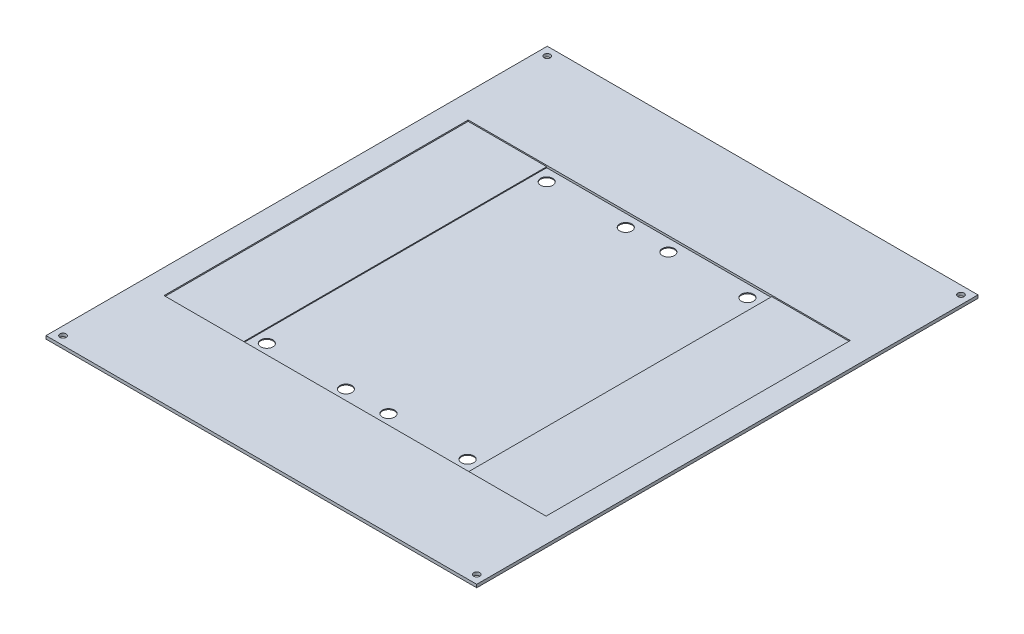
ISO-10303-21;
HEADER;
FILE_DESCRIPTION(('STEP AP214'),'2;1');
FILE_NAME('part.step','',(''),(''),'','','');
FILE_SCHEMA(('AUTOMOTIVE_DESIGN { 1 0 10303 214 1 1 1 1 }'));
ENDSEC;
DATA;
#1=APPLICATION_CONTEXT('core data for automotive mechanical design processes');
#2=APPLICATION_PROTOCOL_DEFINITION('international standard','automotive_design',2000,#1);
#3=PRODUCT_CONTEXT('',#1,'mechanical');
#4=PRODUCT('Part','Part','',(#3));
#5=PRODUCT_RELATED_PRODUCT_CATEGORY('part','',(#4));
#6=PRODUCT_DEFINITION_FORMATION('','',#4);
#7=PRODUCT_DEFINITION_CONTEXT('part definition',#1,'design');
#8=PRODUCT_DEFINITION('design','',#6,#7);
#9=PRODUCT_DEFINITION_SHAPE('','',#8);
#10=(LENGTH_UNIT() NAMED_UNIT(*) SI_UNIT(.MILLI.,.METRE.));
#11=(NAMED_UNIT(*) PLANE_ANGLE_UNIT() SI_UNIT($,.RADIAN.));
#12=(NAMED_UNIT(*) SI_UNIT($,.STERADIAN.) SOLID_ANGLE_UNIT());
#13=UNCERTAINTY_MEASURE_WITH_UNIT(LENGTH_MEASURE(1.E-05),#10,'distance_accuracy_value','');
#14=(GEOMETRIC_REPRESENTATION_CONTEXT(3) GLOBAL_UNCERTAINTY_ASSIGNED_CONTEXT((#13)) GLOBAL_UNIT_ASSIGNED_CONTEXT((#10,
#11,#12)) REPRESENTATION_CONTEXT('',''));
#15=CARTESIAN_POINT('',(0.,0.,0.));
#16=DIRECTION('',(0.,0.,1.));
#17=DIRECTION('',(1.,0.,0.));
#18=AXIS2_PLACEMENT_3D('',#15,#16,#17);
#19=CARTESIAN_POINT('',(169.,1.5,-654.));
#20=DIRECTION('',(-1.,0.,0.));
#21=DIRECTION('',(0.,0.,1.));
#22=AXIS2_PLACEMENT_3D('',#19,#20,#21);
#23=PLANE('',#22);
#24=DIRECTION('',(0.,0.,-1.));
#25=VECTOR('',#24,1.);
#26=CARTESIAN_POINT('',(169.,3.,-654.));
#27=LINE('',#26,#25);
#28=CARTESIAN_POINT('',(169.,3.,-154.));
#29=VERTEX_POINT('',#28);
#30=CARTESIAN_POINT('',(169.,3.,-654.));
#31=VERTEX_POINT('',#30);
#32=EDGE_CURVE('E254',#29,#31,#27,.T.);
#33=ORIENTED_EDGE('',*,*,#32,.F.);
#34=DIRECTION('',(0.,1.,0.));
#35=VECTOR('',#34,1.);
#36=CARTESIAN_POINT('',(169.,1.5,-154.));
#37=LINE('',#36,#35);
#38=CARTESIAN_POINT('',(169.,1.5,-154.));
#39=VERTEX_POINT('',#38);
#40=EDGE_CURVE('E150',#39,#29,#37,.T.);
#41=ORIENTED_EDGE('',*,*,#40,.F.);
#42=DIRECTION('',(0.,0.,1.));
#43=VECTOR('',#42,1.);
#44=CARTESIAN_POINT('',(169.,1.5,-654.));
#45=LINE('',#44,#43);
#46=CARTESIAN_POINT('',(169.,1.5,-654.));
#47=VERTEX_POINT('',#46);
#48=EDGE_CURVE('E248',#47,#39,#45,.T.);
#49=ORIENTED_EDGE('',*,*,#48,.F.);
#50=DIRECTION('',(0.,1.,0.));
#51=VECTOR('',#50,1.);
#52=CARTESIAN_POINT('',(169.,1.5,-654.));
#53=LINE('',#52,#51);
#54=EDGE_CURVE('E452',#47,#31,#53,.T.);
#55=ORIENTED_EDGE('',*,*,#54,.T.);
#56=EDGE_LOOP('',(#33,#41,#49,#55));
#57=FACE_BOUND('',#56,.T.);
#58=ADVANCED_FACE('F44',(#57),#23,.F.);
#59=CARTESIAN_POINT('',(539.,1.5,-654.));
#60=DIRECTION('',(1.,0.,0.));
#61=DIRECTION('',(0.,0.,-1.));
#62=AXIS2_PLACEMENT_3D('',#59,#60,#61);
#63=PLANE('',#62);
#64=DIRECTION('',(0.,0.,1.));
#65=VECTOR('',#64,1.);
#66=CARTESIAN_POINT('',(539.,3.,-654.));
#67=LINE('',#66,#65);
#68=CARTESIAN_POINT('',(539.,3.,-654.));
#69=VERTEX_POINT('',#68);
#70=CARTESIAN_POINT('',(539.,3.,-154.));
#71=VERTEX_POINT('',#70);
#72=EDGE_CURVE('E306',#69,#71,#67,.T.);
#73=ORIENTED_EDGE('',*,*,#72,.F.);
#74=DIRECTION('',(0.,1.,0.));
#75=VECTOR('',#74,1.);
#76=CARTESIAN_POINT('',(539.,1.5,-654.));
#77=LINE('',#76,#75);
#78=CARTESIAN_POINT('',(539.,1.5,-654.));
#79=VERTEX_POINT('',#78);
#80=EDGE_CURVE('E454',#79,#69,#77,.T.);
#81=ORIENTED_EDGE('',*,*,#80,.F.);
#82=DIRECTION('',(0.,0.,-1.));
#83=VECTOR('',#82,1.);
#84=CARTESIAN_POINT('',(539.,1.5,-654.));
#85=LINE('',#84,#83);
#86=CARTESIAN_POINT('',(539.,1.5,-154.));
#87=VERTEX_POINT('',#86);
#88=EDGE_CURVE('E261',#87,#79,#85,.T.);
#89=ORIENTED_EDGE('',*,*,#88,.F.);
#90=DIRECTION('',(0.,1.,0.));
#91=VECTOR('',#90,1.);
#92=CARTESIAN_POINT('',(539.,1.5,-154.));
#93=LINE('',#92,#91);
#94=EDGE_CURVE('E456',#87,#71,#93,.T.);
#95=ORIENTED_EDGE('',*,*,#94,.T.);
#96=EDGE_LOOP('',(#73,#81,#89,#95));
#97=FACE_BOUND('',#96,.T.);
#98=ADVANCED_FACE('F384',(#97),#63,.F.);
#99=CARTESIAN_POINT('',(0.,5.,0.));
#100=DIRECTION('',(1.,0.,0.));
#101=DIRECTION('',(0.,0.,-1.));
#102=AXIS2_PLACEMENT_3D('',#99,#100,#101);
#103=PLANE('',#102);
#104=DIRECTION('',(0.,0.,1.));
#105=VECTOR('',#104,1.);
#106=CARTESIAN_POINT('',(0.,0.,0.));
#107=LINE('',#106,#105);
#108=CARTESIAN_POINT('',(0.,0.,-824.));
#109=VERTEX_POINT('',#108);
#110=CARTESIAN_POINT('',(0.,0.,0.));
#111=VERTEX_POINT('',#110);
#112=EDGE_CURVE('E421',#109,#111,#107,.T.);
#113=ORIENTED_EDGE('',*,*,#112,.T.);
#114=DIRECTION('',(0.,-1.,0.));
#115=VECTOR('',#114,1.);
#116=CARTESIAN_POINT('',(0.,5.,0.));
#117=LINE('',#116,#115);
#118=CARTESIAN_POINT('',(0.,5.,0.));
#119=VERTEX_POINT('',#118);
#120=EDGE_CURVE('E12',#119,#111,#117,.T.);
#121=ORIENTED_EDGE('',*,*,#120,.F.);
#122=DIRECTION('',(0.,0.,1.));
#123=VECTOR('',#122,1.);
#124=CARTESIAN_POINT('',(0.,5.,0.));
#125=LINE('',#124,#123);
#126=CARTESIAN_POINT('',(0.,5.,-824.));
#127=VERTEX_POINT('',#126);
#128=EDGE_CURVE('E286',#127,#119,#125,.T.);
#129=ORIENTED_EDGE('',*,*,#128,.F.);
#130=DIRECTION('',(0.,-1.,0.));
#131=VECTOR('',#130,1.);
#132=CARTESIAN_POINT('',(0.,5.,-824.));
#133=LINE('',#132,#131);
#134=EDGE_CURVE('E430',#127,#109,#133,.T.);
#135=ORIENTED_EDGE('',*,*,#134,.T.);
#136=EDGE_LOOP('',(#113,#121,#129,#135));
#137=FACE_BOUND('',#136,.T.);
#138=ADVANCED_FACE('F46',(#137),#103,.F.);
#139=CARTESIAN_POINT('',(0.,5.,0.));
#140=DIRECTION('',(0.,0.,-1.));
#141=DIRECTION('',(-1.,0.,0.));
#142=AXIS2_PLACEMENT_3D('',#139,#140,#141);
#143=PLANE('',#142);
#144=DIRECTION('',(1.,0.,0.));
#145=VECTOR('',#144,1.);
#146=CARTESIAN_POINT('',(0.,0.,0.));
#147=LINE('',#146,#145);
#148=CARTESIAN_POINT('',(708.,0.,0.));
#149=VERTEX_POINT('',#148);
#150=EDGE_CURVE('E412',#111,#149,#147,.T.);
#151=ORIENTED_EDGE('',*,*,#150,.T.);
#152=DIRECTION('',(0.,-1.,0.));
#153=VECTOR('',#152,1.);
#154=CARTESIAN_POINT('',(708.,5.,0.));
#155=LINE('',#154,#153);
#156=CARTESIAN_POINT('',(708.,5.,0.));
#157=VERTEX_POINT('',#156);
#158=EDGE_CURVE('E53',#157,#149,#155,.T.);
#159=ORIENTED_EDGE('',*,*,#158,.F.);
#160=DIRECTION('',(1.,0.,0.));
#161=VECTOR('',#160,1.);
#162=CARTESIAN_POINT('',(0.,5.,0.));
#163=LINE('',#162,#161);
#164=EDGE_CURVE('E291',#119,#157,#163,.T.);
#165=ORIENTED_EDGE('',*,*,#164,.F.);
#166=ORIENTED_EDGE('',*,*,#120,.T.);
#167=EDGE_LOOP('',(#151,#159,#165,#166));
#168=FACE_BOUND('',#167,.T.);
#169=ADVANCED_FACE('F403',(#168),#143,.F.);
#170=CARTESIAN_POINT('',(708.,5.,0.));
#171=DIRECTION('',(-1.,0.,0.));
#172=DIRECTION('',(0.,0.,1.));
#173=AXIS2_PLACEMENT_3D('',#170,#171,#172);
#174=PLANE('',#173);
#175=DIRECTION('',(0.,0.,-1.));
#176=VECTOR('',#175,1.);
#177=CARTESIAN_POINT('',(708.,0.,0.));
#178=LINE('',#177,#176);
#179=CARTESIAN_POINT('',(708.,0.,-824.));
#180=VERTEX_POINT('',#179);
#181=EDGE_CURVE('E420',#149,#180,#178,.T.);
#182=ORIENTED_EDGE('',*,*,#181,.T.);
#183=DIRECTION('',(0.,-1.,0.));
#184=VECTOR('',#183,1.);
#185=CARTESIAN_POINT('',(708.,5.,-824.));
#186=LINE('',#185,#184);
#187=CARTESIAN_POINT('',(708.,5.,-824.));
#188=VERTEX_POINT('',#187);
#189=EDGE_CURVE('E425',#188,#180,#186,.T.);
#190=ORIENTED_EDGE('',*,*,#189,.F.);
#191=DIRECTION('',(0.,0.,-1.));
#192=VECTOR('',#191,1.);
#193=CARTESIAN_POINT('',(708.,5.,0.));
#194=LINE('',#193,#192);
#195=EDGE_CURVE('E297',#157,#188,#194,.T.);
#196=ORIENTED_EDGE('',*,*,#195,.F.);
#197=ORIENTED_EDGE('',*,*,#158,.T.);
#198=EDGE_LOOP('',(#182,#190,#196,#197));
#199=FACE_BOUND('',#198,.T.);
#200=ADVANCED_FACE('F400',(#199),#174,.F.);
#201=CARTESIAN_POINT('',(0.,5.,-824.));
#202=DIRECTION('',(0.,0.,1.));
#203=DIRECTION('',(1.,0.,0.));
#204=AXIS2_PLACEMENT_3D('',#201,#202,#203);
#205=PLANE('',#204);
#206=DIRECTION('',(-1.,0.,0.));
#207=VECTOR('',#206,1.);
#208=CARTESIAN_POINT('',(0.,0.,-824.));
#209=LINE('',#208,#207);
#210=EDGE_CURVE('E292',#180,#109,#209,.T.);
#211=ORIENTED_EDGE('',*,*,#210,.T.);
#212=ORIENTED_EDGE('',*,*,#134,.F.);
#213=DIRECTION('',(-1.,0.,0.));
#214=VECTOR('',#213,1.);
#215=CARTESIAN_POINT('',(0.,5.,-824.));
#216=LINE('',#215,#214);
#217=EDGE_CURVE('E301',#188,#127,#216,.T.);
#218=ORIENTED_EDGE('',*,*,#217,.F.);
#219=ORIENTED_EDGE('',*,*,#189,.T.);
#220=EDGE_LOOP('',(#211,#212,#218,#219));
#221=FACE_BOUND('',#220,.T.);
#222=ADVANCED_FACE('F363',(#221),#205,.F.);
#223=CARTESIAN_POINT('',(0.,5.,0.));
#224=DIRECTION('',(0.,-1.,0.));
#225=DIRECTION('',(0.,0.,-1.));
#226=AXIS2_PLACEMENT_3D('',#223,#224,#225);
#227=PLANE('',#226);
#228=CARTESIAN_POINT('',(694.,5.,-810.));
#229=DIRECTION('',(0.,1.,0.));
#230=DIRECTION('',(0.,0.,-1.));
#231=AXIS2_PLACEMENT_3D('',#228,#229,#230);
#232=CIRCLE('',#231,5.1);
#233=CARTESIAN_POINT('',(694.,5.,-815.1));
#234=VERTEX_POINT('',#233);
#235=EDGE_CURVE('E234',#234,#234,#232,.T.);
#236=ORIENTED_EDGE('',*,*,#235,.F.);
#237=EDGE_LOOP('',(#236));
#238=FACE_BOUND('',#237,.T.);
#239=CARTESIAN_POINT('',(694.,5.,-14.));
#240=DIRECTION('',(0.,-1.,0.));
#241=DIRECTION('',(0.,0.,1.));
#242=AXIS2_PLACEMENT_3D('',#239,#240,#241);
#243=CIRCLE('',#242,5.1);
#244=CARTESIAN_POINT('',(694.,5.,-8.90000000000001));
#245=VERTEX_POINT('',#244);
#246=EDGE_CURVE('E337',#245,#245,#243,.T.);
#247=ORIENTED_EDGE('',*,*,#246,.T.);
#248=EDGE_LOOP('',(#247));
#249=FACE_BOUND('',#248,.T.);
#250=CARTESIAN_POINT('',(14.,5.,-810.));
#251=DIRECTION('',(0.,-1.,0.));
#252=DIRECTION('',(0.,0.,-1.));
#253=AXIS2_PLACEMENT_3D('',#250,#251,#252);
#254=CIRCLE('',#253,5.1);
#255=CARTESIAN_POINT('',(14.,5.,-815.1));
#256=VERTEX_POINT('',#255);
#257=EDGE_CURVE('E334',#256,#256,#254,.T.);
#258=ORIENTED_EDGE('',*,*,#257,.T.);
#259=EDGE_LOOP('',(#258));
#260=FACE_BOUND('',#259,.T.);
#261=CARTESIAN_POINT('',(14.,5.,-14.));
#262=DIRECTION('',(0.,1.,0.));
#263=DIRECTION('',(0.,0.,1.));
#264=AXIS2_PLACEMENT_3D('',#261,#262,#263);
#265=CIRCLE('',#264,5.1);
#266=CARTESIAN_POINT('',(14.,5.,-8.90000000000001));
#267=VERTEX_POINT('',#266);
#268=EDGE_CURVE('E168',#267,#267,#265,.T.);
#269=ORIENTED_EDGE('',*,*,#268,.F.);
#270=EDGE_LOOP('',(#269));
#271=FACE_BOUND('',#270,.T.);
#272=DIRECTION('',(-1.,0.,0.));
#273=VECTOR('',#272,1.);
#274=CARTESIAN_POINT('',(169.,5.,-654.));
#275=LINE('',#274,#273);
#276=CARTESIAN_POINT('',(668.,5.,-654.));
#277=VERTEX_POINT('',#276);
#278=CARTESIAN_POINT('',(40.,5.,-654.));
#279=VERTEX_POINT('',#278);
#280=EDGE_CURVE('E253',#277,#279,#275,.T.);
#281=ORIENTED_EDGE('',*,*,#280,.F.);
#282=DIRECTION('',(0.,0.,-1.));
#283=VECTOR('',#282,1.);
#284=CARTESIAN_POINT('',(668.,5.,-654.));
#285=LINE('',#284,#283);
#286=CARTESIAN_POINT('',(668.,5.,-154.));
#287=VERTEX_POINT('',#286);
#288=EDGE_CURVE('E159',#287,#277,#285,.T.);
#289=ORIENTED_EDGE('',*,*,#288,.F.);
#290=DIRECTION('',(1.,0.,0.));
#291=VECTOR('',#290,1.);
#292=CARTESIAN_POINT('',(169.,5.,-154.));
#293=LINE('',#292,#291);
#294=CARTESIAN_POINT('',(40.0000000000001,5.,-154.));
#295=VERTEX_POINT('',#294);
#296=EDGE_CURVE('E271',#295,#287,#293,.T.);
#297=ORIENTED_EDGE('',*,*,#296,.F.);
#298=DIRECTION('',(0.,0.,1.));
#299=VECTOR('',#298,1.);
#300=CARTESIAN_POINT('',(40.,5.,-654.));
#301=LINE('',#300,#299);
#302=EDGE_CURVE('E143',#279,#295,#301,.T.);
#303=ORIENTED_EDGE('',*,*,#302,.F.);
#304=EDGE_LOOP('',(#281,#289,#297,#303));
#305=FACE_BOUND('',#304,.T.);
#306=ORIENTED_EDGE('',*,*,#128,.T.);
#307=ORIENTED_EDGE('',*,*,#164,.T.);
#308=ORIENTED_EDGE('',*,*,#195,.T.);
#309=ORIENTED_EDGE('',*,*,#217,.T.);
#310=EDGE_LOOP('',(#306,#307,#308,#309));
#311=FACE_BOUND('',#310,.T.);
#312=ADVANCED_FACE('F319',(#238,#249,#260,#271,#305,#311),#227,.F.);
#313=CARTESIAN_POINT('',(0.,0.,0.));
#314=DIRECTION('',(0.,-1.,0.));
#315=DIRECTION('',(0.,0.,-1.));
#316=AXIS2_PLACEMENT_3D('',#313,#314,#315);
#317=PLANE('',#316);
#318=CARTESIAN_POINT('',(319.,0.,-634.));
#319=DIRECTION('',(0.,1.,0.));
#320=DIRECTION('',(0.,0.,1.));
#321=AXIS2_PLACEMENT_3D('',#318,#319,#320);
#322=CIRCLE('',#321,9.99999999999998);
#323=CARTESIAN_POINT('',(319.,0.,-624.));
#324=VERTEX_POINT('',#323);
#325=EDGE_CURVE('E199',#324,#324,#322,.T.);
#326=ORIENTED_EDGE('',*,*,#325,.T.);
#327=EDGE_LOOP('',(#326));
#328=FACE_BOUND('',#327,.T.);
#329=CARTESIAN_POINT('',(389.,0.,-634.));
#330=DIRECTION('',(0.,1.,0.));
#331=DIRECTION('',(0.,0.,1.));
#332=AXIS2_PLACEMENT_3D('',#329,#330,#331);
#333=CIRCLE('',#332,10.);
#334=CARTESIAN_POINT('',(389.,0.,-624.));
#335=VERTEX_POINT('',#334);
#336=EDGE_CURVE('E208',#335,#335,#333,.T.);
#337=ORIENTED_EDGE('',*,*,#336,.T.);
#338=EDGE_LOOP('',(#337));
#339=FACE_BOUND('',#338,.T.);
#340=CARTESIAN_POINT('',(519.,0.,-634.));
#341=DIRECTION('',(0.,1.,0.));
#342=DIRECTION('',(0.,0.,1.));
#343=AXIS2_PLACEMENT_3D('',#340,#341,#342);
#344=CIRCLE('',#343,9.99999999999998);
#345=CARTESIAN_POINT('',(519.,0.,-624.));
#346=VERTEX_POINT('',#345);
#347=EDGE_CURVE('E216',#346,#346,#344,.T.);
#348=ORIENTED_EDGE('',*,*,#347,.T.);
#349=EDGE_LOOP('',(#348));
#350=FACE_BOUND('',#349,.T.);
#351=CARTESIAN_POINT('',(519.,0.,-174.));
#352=DIRECTION('',(0.,1.,0.));
#353=DIRECTION('',(0.,0.,-1.));
#354=AXIS2_PLACEMENT_3D('',#351,#352,#353);
#355=CIRCLE('',#354,9.99999999999998);
#356=CARTESIAN_POINT('',(519.,0.,-184.));
#357=VERTEX_POINT('',#356);
#358=EDGE_CURVE('E227',#357,#357,#355,.T.);
#359=ORIENTED_EDGE('',*,*,#358,.T.);
#360=EDGE_LOOP('',(#359));
#361=FACE_BOUND('',#360,.T.);
#362=CARTESIAN_POINT('',(389.,0.,-174.));
#363=DIRECTION('',(0.,1.,0.));
#364=DIRECTION('',(0.,0.,-1.));
#365=AXIS2_PLACEMENT_3D('',#362,#363,#364);
#366=CIRCLE('',#365,10.);
#367=CARTESIAN_POINT('',(389.,0.,-184.));
#368=VERTEX_POINT('',#367);
#369=EDGE_CURVE('E441',#368,#368,#366,.T.);
#370=ORIENTED_EDGE('',*,*,#369,.T.);
#371=EDGE_LOOP('',(#370));
#372=FACE_BOUND('',#371,.T.);
#373=CARTESIAN_POINT('',(319.,0.,-174.));
#374=DIRECTION('',(0.,1.,0.));
#375=DIRECTION('',(0.,0.,-1.));
#376=AXIS2_PLACEMENT_3D('',#373,#374,#375);
#377=CIRCLE('',#376,9.99999999999998);
#378=CARTESIAN_POINT('',(319.,0.,-184.));
#379=VERTEX_POINT('',#378);
#380=EDGE_CURVE('E445',#379,#379,#377,.T.);
#381=ORIENTED_EDGE('',*,*,#380,.T.);
#382=EDGE_LOOP('',(#381));
#383=FACE_BOUND('',#382,.T.);
#384=CARTESIAN_POINT('',(189.,0.,-174.));
#385=DIRECTION('',(0.,1.,0.));
#386=DIRECTION('',(0.,0.,-1.));
#387=AXIS2_PLACEMENT_3D('',#384,#385,#386);
#388=CIRCLE('',#387,10.);
#389=CARTESIAN_POINT('',(189.,0.,-184.));
#390=VERTEX_POINT('',#389);
#391=EDGE_CURVE('E200',#390,#390,#388,.T.);
#392=ORIENTED_EDGE('',*,*,#391,.T.);
#393=EDGE_LOOP('',(#392));
#394=FACE_BOUND('',#393,.T.);
#395=CARTESIAN_POINT('',(189.,0.,-634.));
#396=DIRECTION('',(0.,1.,0.));
#397=DIRECTION('',(0.,0.,1.));
#398=AXIS2_PLACEMENT_3D('',#395,#396,#397);
#399=CIRCLE('',#398,10.);
#400=CARTESIAN_POINT('',(189.,0.,-624.));
#401=VERTEX_POINT('',#400);
#402=EDGE_CURVE('E231',#401,#401,#399,.T.);
#403=ORIENTED_EDGE('',*,*,#402,.T.);
#404=EDGE_LOOP('',(#403));
#405=FACE_BOUND('',#404,.T.);
#406=CARTESIAN_POINT('',(694.,0.,-810.));
#407=DIRECTION('',(0.,-1.,0.));
#408=DIRECTION('',(0.,0.,-1.));
#409=AXIS2_PLACEMENT_3D('',#406,#407,#408);
#410=CIRCLE('',#409,5.1);
#411=CARTESIAN_POINT('',(694.,0.,-815.1));
#412=VERTEX_POINT('',#411);
#413=EDGE_CURVE('E48',#412,#412,#410,.T.);
#414=ORIENTED_EDGE('',*,*,#413,.F.);
#415=EDGE_LOOP('',(#414));
#416=FACE_BOUND('',#415,.T.);
#417=CARTESIAN_POINT('',(694.,0.,-14.));
#418=DIRECTION('',(0.,-1.,0.));
#419=DIRECTION('',(0.,0.,-1.));
#420=AXIS2_PLACEMENT_3D('',#417,#418,#419);
#421=CIRCLE('',#420,5.1);
#422=CARTESIAN_POINT('',(694.,0.,-19.1));
#423=VERTEX_POINT('',#422);
#424=EDGE_CURVE('E335',#423,#423,#421,.F.);
#425=ORIENTED_EDGE('',*,*,#424,.T.);
#426=EDGE_LOOP('',(#425));
#427=FACE_BOUND('',#426,.T.);
#428=CARTESIAN_POINT('',(14.,0.,-810.));
#429=DIRECTION('',(0.,-1.,0.));
#430=DIRECTION('',(0.,0.,-1.));
#431=AXIS2_PLACEMENT_3D('',#428,#429,#430);
#432=CIRCLE('',#431,5.1);
#433=CARTESIAN_POINT('',(14.,0.,-815.1));
#434=VERTEX_POINT('',#433);
#435=EDGE_CURVE('E330',#434,#434,#432,.F.);
#436=ORIENTED_EDGE('',*,*,#435,.T.);
#437=EDGE_LOOP('',(#436));
#438=FACE_BOUND('',#437,.T.);
#439=CARTESIAN_POINT('',(14.,0.,-14.));
#440=DIRECTION('',(0.,-1.,0.));
#441=DIRECTION('',(0.,0.,-1.));
#442=AXIS2_PLACEMENT_3D('',#439,#440,#441);
#443=CIRCLE('',#442,5.1);
#444=CARTESIAN_POINT('',(14.,0.,-19.1));
#445=VERTEX_POINT('',#444);
#446=EDGE_CURVE('E323',#445,#445,#443,.T.);
#447=ORIENTED_EDGE('',*,*,#446,.F.);
#448=EDGE_LOOP('',(#447));
#449=FACE_BOUND('',#448,.T.);
#450=ORIENTED_EDGE('',*,*,#112,.F.);
#451=ORIENTED_EDGE('',*,*,#210,.F.);
#452=ORIENTED_EDGE('',*,*,#181,.F.);
#453=ORIENTED_EDGE('',*,*,#150,.F.);
#454=EDGE_LOOP('',(#450,#451,#452,#453));
#455=FACE_BOUND('',#454,.T.);
#456=ADVANCED_FACE('F362',(#328,#339,#350,#361,#372,#383,#394,#405,#416,#427,#438,#449,#455),
#317,.T.);
#457=CARTESIAN_POINT('',(169.,1.5,-654.));
#458=DIRECTION('',(0.,0.,-1.));
#459=DIRECTION('',(-1.,0.,0.));
#460=AXIS2_PLACEMENT_3D('',#457,#458,#459);
#461=PLANE('',#460);
#462=ORIENTED_EDGE('',*,*,#280,.T.);
#463=DIRECTION('',(0.,1.,0.));
#464=VECTOR('',#463,1.);
#465=CARTESIAN_POINT('',(40.,3.,-654.));
#466=LINE('',#465,#464);
#467=CARTESIAN_POINT('',(40.,3.,-654.));
#468=VERTEX_POINT('',#467);
#469=EDGE_CURVE('E309',#468,#279,#466,.T.);
#470=ORIENTED_EDGE('',*,*,#469,.F.);
#471=DIRECTION('',(-1.,0.,0.));
#472=VECTOR('',#471,1.);
#473=CARTESIAN_POINT('',(40.,3.,-654.));
#474=LINE('',#473,#472);
#475=EDGE_CURVE('E156',#31,#468,#474,.T.);
#476=ORIENTED_EDGE('',*,*,#475,.F.);
#477=ORIENTED_EDGE('',*,*,#54,.F.);
#478=DIRECTION('',(-1.,0.,0.));
#479=VECTOR('',#478,1.);
#480=CARTESIAN_POINT('',(169.,1.5,-654.));
#481=LINE('',#480,#479);
#482=EDGE_CURVE('E266',#79,#47,#481,.T.);
#483=ORIENTED_EDGE('',*,*,#482,.F.);
#484=ORIENTED_EDGE('',*,*,#80,.T.);
#485=CARTESIAN_POINT('',(668.,3.,-654.));
#486=VERTEX_POINT('',#485);
#487=EDGE_CURVE('E61',#486,#69,#474,.T.);
#488=ORIENTED_EDGE('',*,*,#487,.F.);
#489=DIRECTION('',(0.,1.,0.));
#490=VECTOR('',#489,1.);
#491=CARTESIAN_POINT('',(668.,3.,-654.));
#492=LINE('',#491,#490);
#493=EDGE_CURVE('E313',#486,#277,#492,.T.);
#494=ORIENTED_EDGE('',*,*,#493,.T.);
#495=EDGE_LOOP('',(#462,#470,#476,#477,#483,#484,#488,#494));
#496=FACE_BOUND('',#495,.T.);
#497=ADVANCED_FACE('F396',(#496),#461,.F.);
#498=CARTESIAN_POINT('',(169.,1.5,-154.));
#499=DIRECTION('',(0.,0.,1.));
#500=DIRECTION('',(1.,0.,0.));
#501=AXIS2_PLACEMENT_3D('',#498,#499,#500);
#502=PLANE('',#501);
#503=ORIENTED_EDGE('',*,*,#296,.T.);
#504=DIRECTION('',(0.,1.,0.));
#505=VECTOR('',#504,1.);
#506=CARTESIAN_POINT('',(668.,3.,-154.));
#507=LINE('',#506,#505);
#508=CARTESIAN_POINT('',(668.,3.,-154.));
#509=VERTEX_POINT('',#508);
#510=EDGE_CURVE('E145',#509,#287,#507,.T.);
#511=ORIENTED_EDGE('',*,*,#510,.F.);
#512=DIRECTION('',(1.,0.,0.));
#513=VECTOR('',#512,1.);
#514=CARTESIAN_POINT('',(40.0000000000001,3.,-154.));
#515=LINE('',#514,#513);
#516=EDGE_CURVE('E153',#71,#509,#515,.T.);
#517=ORIENTED_EDGE('',*,*,#516,.F.);
#518=ORIENTED_EDGE('',*,*,#94,.F.);
#519=DIRECTION('',(1.,0.,0.));
#520=VECTOR('',#519,1.);
#521=CARTESIAN_POINT('',(169.,1.5,-154.));
#522=LINE('',#521,#520);
#523=EDGE_CURVE('E252',#39,#87,#522,.T.);
#524=ORIENTED_EDGE('',*,*,#523,.F.);
#525=ORIENTED_EDGE('',*,*,#40,.T.);
#526=CARTESIAN_POINT('',(40.0000000000001,3.,-154.));
#527=VERTEX_POINT('',#526);
#528=EDGE_CURVE('E69',#527,#29,#515,.T.);
#529=ORIENTED_EDGE('',*,*,#528,.F.);
#530=DIRECTION('',(0.,1.,0.));
#531=VECTOR('',#530,1.);
#532=CARTESIAN_POINT('',(40.0000000000001,3.,-154.));
#533=LINE('',#532,#531);
#534=EDGE_CURVE('E138',#527,#295,#533,.T.);
#535=ORIENTED_EDGE('',*,*,#534,.T.);
#536=EDGE_LOOP('',(#503,#511,#517,#518,#524,#525,#529,#535));
#537=FACE_BOUND('',#536,.T.);
#538=ADVANCED_FACE('F148',(#537),#502,.F.);
#539=CARTESIAN_POINT('',(0.,1.5,0.));
#540=DIRECTION('',(0.,1.,0.));
#541=DIRECTION('',(0.,0.,1.));
#542=AXIS2_PLACEMENT_3D('',#539,#540,#541);
#543=PLANE('',#542);
#544=CARTESIAN_POINT('',(319.,1.5,-634.));
#545=DIRECTION('',(0.,1.,0.));
#546=DIRECTION('',(0.,0.,1.));
#547=AXIS2_PLACEMENT_3D('',#544,#545,#546);
#548=CIRCLE('',#547,9.99999999999998);
#549=CARTESIAN_POINT('',(319.,1.5,-624.));
#550=VERTEX_POINT('',#549);
#551=EDGE_CURVE('E192',#550,#550,#548,.T.);
#552=ORIENTED_EDGE('',*,*,#551,.F.);
#553=EDGE_LOOP('',(#552));
#554=FACE_BOUND('',#553,.T.);
#555=CARTESIAN_POINT('',(389.,1.5,-634.));
#556=DIRECTION('',(0.,1.,0.));
#557=DIRECTION('',(0.,0.,1.));
#558=AXIS2_PLACEMENT_3D('',#555,#556,#557);
#559=CIRCLE('',#558,10.);
#560=CARTESIAN_POINT('',(389.,1.5,-624.));
#561=VERTEX_POINT('',#560);
#562=EDGE_CURVE('E203',#561,#561,#559,.T.);
#563=ORIENTED_EDGE('',*,*,#562,.F.);
#564=EDGE_LOOP('',(#563));
#565=FACE_BOUND('',#564,.T.);
#566=CARTESIAN_POINT('',(519.,1.5,-634.));
#567=DIRECTION('',(0.,1.,0.));
#568=DIRECTION('',(0.,0.,1.));
#569=AXIS2_PLACEMENT_3D('',#566,#567,#568);
#570=CIRCLE('',#569,9.99999999999998);
#571=CARTESIAN_POINT('',(519.,1.5,-624.));
#572=VERTEX_POINT('',#571);
#573=EDGE_CURVE('E211',#572,#572,#570,.T.);
#574=ORIENTED_EDGE('',*,*,#573,.F.);
#575=EDGE_LOOP('',(#574));
#576=FACE_BOUND('',#575,.T.);
#577=CARTESIAN_POINT('',(519.,1.5,-174.));
#578=DIRECTION('',(0.,1.,0.));
#579=DIRECTION('',(0.,0.,-1.));
#580=AXIS2_PLACEMENT_3D('',#577,#578,#579);
#581=CIRCLE('',#580,9.99999999999998);
#582=CARTESIAN_POINT('',(519.,1.5,-184.));
#583=VERTEX_POINT('',#582);
#584=EDGE_CURVE('E222',#583,#583,#581,.T.);
#585=ORIENTED_EDGE('',*,*,#584,.F.);
#586=EDGE_LOOP('',(#585));
#587=FACE_BOUND('',#586,.T.);
#588=CARTESIAN_POINT('',(389.,1.5,-174.));
#589=DIRECTION('',(0.,1.,0.));
#590=DIRECTION('',(0.,0.,-1.));
#591=AXIS2_PLACEMENT_3D('',#588,#589,#590);
#592=CIRCLE('',#591,10.);
#593=CARTESIAN_POINT('',(389.,1.5,-184.));
#594=VERTEX_POINT('',#593);
#595=EDGE_CURVE('E230',#594,#594,#592,.T.);
#596=ORIENTED_EDGE('',*,*,#595,.F.);
#597=EDGE_LOOP('',(#596));
#598=FACE_BOUND('',#597,.T.);
#599=CARTESIAN_POINT('',(319.,1.5,-174.));
#600=DIRECTION('',(0.,1.,0.));
#601=DIRECTION('',(0.,0.,-1.));
#602=AXIS2_PLACEMENT_3D('',#599,#600,#601);
#603=CIRCLE('',#602,9.99999999999998);
#604=CARTESIAN_POINT('',(319.,1.5,-184.));
#605=VERTEX_POINT('',#604);
#606=EDGE_CURVE('E442',#605,#605,#603,.T.);
#607=ORIENTED_EDGE('',*,*,#606,.F.);
#608=EDGE_LOOP('',(#607));
#609=FACE_BOUND('',#608,.T.);
#610=CARTESIAN_POINT('',(189.,1.5,-174.));
#611=DIRECTION('',(0.,1.,0.));
#612=DIRECTION('',(0.,0.,-1.));
#613=AXIS2_PLACEMENT_3D('',#610,#611,#612);
#614=CIRCLE('',#613,10.);
#615=CARTESIAN_POINT('',(189.,1.5,-184.));
#616=VERTEX_POINT('',#615);
#617=EDGE_CURVE('E447',#616,#616,#614,.T.);
#618=ORIENTED_EDGE('',*,*,#617,.F.);
#619=EDGE_LOOP('',(#618));
#620=FACE_BOUND('',#619,.T.);
#621=CARTESIAN_POINT('',(189.,1.5,-634.));
#622=DIRECTION('',(0.,1.,0.));
#623=DIRECTION('',(0.,0.,1.));
#624=AXIS2_PLACEMENT_3D('',#621,#622,#623);
#625=CIRCLE('',#624,10.);
#626=CARTESIAN_POINT('',(189.,1.5,-624.));
#627=VERTEX_POINT('',#626);
#628=EDGE_CURVE('E198',#627,#627,#625,.T.);
#629=ORIENTED_EDGE('',*,*,#628,.F.);
#630=EDGE_LOOP('',(#629));
#631=FACE_BOUND('',#630,.T.);
#632=ORIENTED_EDGE('',*,*,#48,.T.);
#633=ORIENTED_EDGE('',*,*,#523,.T.);
#634=ORIENTED_EDGE('',*,*,#88,.T.);
#635=ORIENTED_EDGE('',*,*,#482,.T.);
#636=EDGE_LOOP('',(#632,#633,#634,#635));
#637=FACE_BOUND('',#636,.T.);
#638=ADVANCED_FACE('F466',(#554,#565,#576,#587,#598,#609,#620,#631,#637),#543,.T.);
#639=CARTESIAN_POINT('',(0.,3.,0.));
#640=DIRECTION('',(0.,1.,0.));
#641=DIRECTION('',(0.,0.,1.));
#642=AXIS2_PLACEMENT_3D('',#639,#640,#641);
#643=PLANE('',#642);
#644=ORIENTED_EDGE('',*,*,#72,.T.);
#645=ORIENTED_EDGE('',*,*,#516,.T.);
#646=DIRECTION('',(0.,0.,-1.));
#647=VECTOR('',#646,1.);
#648=CARTESIAN_POINT('',(668.,3.,-654.));
#649=LINE('',#648,#647);
#650=EDGE_CURVE('E152',#509,#486,#649,.T.);
#651=ORIENTED_EDGE('',*,*,#650,.T.);
#652=ORIENTED_EDGE('',*,*,#487,.T.);
#653=EDGE_LOOP('',(#644,#645,#651,#652));
#654=FACE_BOUND('',#653,.T.);
#655=ADVANCED_FACE('F463',(#654),#643,.T.);
#656=CARTESIAN_POINT('',(668.,3.,-654.));
#657=DIRECTION('',(1.,0.,0.));
#658=DIRECTION('',(0.,0.,-1.));
#659=AXIS2_PLACEMENT_3D('',#656,#657,#658);
#660=PLANE('',#659);
#661=ORIENTED_EDGE('',*,*,#288,.T.);
#662=ORIENTED_EDGE('',*,*,#493,.F.);
#663=ORIENTED_EDGE('',*,*,#650,.F.);
#664=ORIENTED_EDGE('',*,*,#510,.T.);
#665=EDGE_LOOP('',(#661,#662,#663,#664));
#666=FACE_BOUND('',#665,.T.);
#667=ADVANCED_FACE('F474',(#666),#660,.F.);
#668=ORIENTED_EDGE('',*,*,#32,.T.);
#669=ORIENTED_EDGE('',*,*,#475,.T.);
#670=DIRECTION('',(0.,0.,1.));
#671=VECTOR('',#670,1.);
#672=CARTESIAN_POINT('',(40.,3.,-654.));
#673=LINE('',#672,#671);
#674=EDGE_CURVE('E141',#468,#527,#673,.T.);
#675=ORIENTED_EDGE('',*,*,#674,.T.);
#676=ORIENTED_EDGE('',*,*,#528,.T.);
#677=EDGE_LOOP('',(#668,#669,#675,#676));
#678=FACE_BOUND('',#677,.T.);
#679=ADVANCED_FACE('F154',(#678),#643,.T.);
#680=CARTESIAN_POINT('',(40.,3.,-654.));
#681=DIRECTION('',(-1.,0.,0.));
#682=DIRECTION('',(0.,0.,1.));
#683=AXIS2_PLACEMENT_3D('',#680,#681,#682);
#684=PLANE('',#683);
#685=ORIENTED_EDGE('',*,*,#302,.T.);
#686=ORIENTED_EDGE('',*,*,#534,.F.);
#687=ORIENTED_EDGE('',*,*,#674,.F.);
#688=ORIENTED_EDGE('',*,*,#469,.T.);
#689=EDGE_LOOP('',(#685,#686,#687,#688));
#690=FACE_BOUND('',#689,.T.);
#691=ADVANCED_FACE('F139',(#690),#684,.F.);
#692=CARTESIAN_POINT('',(14.,-18.2,-14.));
#693=DIRECTION('',(0.,1.,0.));
#694=DIRECTION('',(0.,0.,1.));
#695=AXIS2_PLACEMENT_3D('',#692,#693,#694);
#696=CYLINDRICAL_SURFACE('',#695,5.1);
#697=ORIENTED_EDGE('',*,*,#446,.T.);
#698=EDGE_LOOP('',(#697));
#699=FACE_BOUND('',#698,.T.);
#700=ORIENTED_EDGE('',*,*,#268,.T.);
#701=EDGE_LOOP('',(#700));
#702=FACE_BOUND('',#701,.T.);
#703=ADVANCED_FACE('F370',(#699,#702),#696,.F.);
#704=CARTESIAN_POINT('',(14.,-18.2,-810.));
#705=DIRECTION('',(0.,1.,0.));
#706=DIRECTION('',(0.,0.,1.));
#707=AXIS2_PLACEMENT_3D('',#704,#705,#706);
#708=CYLINDRICAL_SURFACE('',#707,5.1);
#709=ORIENTED_EDGE('',*,*,#435,.F.);
#710=EDGE_LOOP('',(#709));
#711=FACE_BOUND('',#710,.T.);
#712=ORIENTED_EDGE('',*,*,#257,.F.);
#713=EDGE_LOOP('',(#712));
#714=FACE_BOUND('',#713,.T.);
#715=ADVANCED_FACE('F372',(#711,#714),#708,.F.);
#716=CARTESIAN_POINT('',(694.,-18.2,-14.));
#717=DIRECTION('',(0.,1.,0.));
#718=DIRECTION('',(0.,0.,1.));
#719=AXIS2_PLACEMENT_3D('',#716,#717,#718);
#720=CYLINDRICAL_SURFACE('',#719,5.1);
#721=ORIENTED_EDGE('',*,*,#424,.F.);
#722=EDGE_LOOP('',(#721));
#723=FACE_BOUND('',#722,.T.);
#724=ORIENTED_EDGE('',*,*,#246,.F.);
#725=EDGE_LOOP('',(#724));
#726=FACE_BOUND('',#725,.T.);
#727=ADVANCED_FACE('F378',(#723,#726),#720,.F.);
#728=CARTESIAN_POINT('',(694.,-18.2,-810.));
#729=DIRECTION('',(0.,1.,0.));
#730=DIRECTION('',(0.,0.,1.));
#731=AXIS2_PLACEMENT_3D('',#728,#729,#730);
#732=CYLINDRICAL_SURFACE('',#731,5.1);
#733=ORIENTED_EDGE('',*,*,#413,.T.);
#734=EDGE_LOOP('',(#733));
#735=FACE_BOUND('',#734,.T.);
#736=ORIENTED_EDGE('',*,*,#235,.T.);
#737=EDGE_LOOP('',(#736));
#738=FACE_BOUND('',#737,.T.);
#739=ADVANCED_FACE('F359',(#735,#738),#732,.F.);
#740=CARTESIAN_POINT('',(189.,0.,-634.));
#741=DIRECTION('',(0.,1.,0.));
#742=DIRECTION('',(0.,0.,1.));
#743=AXIS2_PLACEMENT_3D('',#740,#741,#742);
#744=CYLINDRICAL_SURFACE('',#743,10.);
#745=ORIENTED_EDGE('',*,*,#402,.F.);
#746=EDGE_LOOP('',(#745));
#747=FACE_BOUND('',#746,.T.);
#748=ORIENTED_EDGE('',*,*,#628,.T.);
#749=EDGE_LOOP('',(#748));
#750=FACE_BOUND('',#749,.T.);
#751=ADVANCED_FACE('F559',(#747,#750),#744,.F.);
#752=CARTESIAN_POINT('',(189.,0.,-174.));
#753=DIRECTION('',(0.,1.,0.));
#754=DIRECTION('',(0.,0.,1.));
#755=AXIS2_PLACEMENT_3D('',#752,#753,#754);
#756=CYLINDRICAL_SURFACE('',#755,10.);
#757=ORIENTED_EDGE('',*,*,#391,.F.);
#758=EDGE_LOOP('',(#757));
#759=FACE_BOUND('',#758,.T.);
#760=ORIENTED_EDGE('',*,*,#617,.T.);
#761=EDGE_LOOP('',(#760));
#762=FACE_BOUND('',#761,.T.);
#763=ADVANCED_FACE('F581',(#759,#762),#756,.F.);
#764=CARTESIAN_POINT('',(319.,0.,-174.));
#765=DIRECTION('',(0.,1.,0.));
#766=DIRECTION('',(0.,0.,1.));
#767=AXIS2_PLACEMENT_3D('',#764,#765,#766);
#768=CYLINDRICAL_SURFACE('',#767,9.99999999999998);
#769=ORIENTED_EDGE('',*,*,#380,.F.);
#770=EDGE_LOOP('',(#769));
#771=FACE_BOUND('',#770,.T.);
#772=ORIENTED_EDGE('',*,*,#606,.T.);
#773=EDGE_LOOP('',(#772));
#774=FACE_BOUND('',#773,.T.);
#775=ADVANCED_FACE('F592',(#771,#774),#768,.F.);
#776=CARTESIAN_POINT('',(389.,0.,-174.));
#777=DIRECTION('',(0.,1.,0.));
#778=DIRECTION('',(0.,0.,1.));
#779=AXIS2_PLACEMENT_3D('',#776,#777,#778);
#780=CYLINDRICAL_SURFACE('',#779,10.);
#781=ORIENTED_EDGE('',*,*,#369,.F.);
#782=EDGE_LOOP('',(#781));
#783=FACE_BOUND('',#782,.T.);
#784=ORIENTED_EDGE('',*,*,#595,.T.);
#785=EDGE_LOOP('',(#784));
#786=FACE_BOUND('',#785,.T.);
#787=ADVANCED_FACE('F603',(#783,#786),#780,.F.);
#788=CARTESIAN_POINT('',(519.,0.,-174.));
#789=DIRECTION('',(0.,1.,0.));
#790=DIRECTION('',(0.,0.,1.));
#791=AXIS2_PLACEMENT_3D('',#788,#789,#790);
#792=CYLINDRICAL_SURFACE('',#791,9.99999999999998);
#793=ORIENTED_EDGE('',*,*,#358,.F.);
#794=EDGE_LOOP('',(#793));
#795=FACE_BOUND('',#794,.T.);
#796=ORIENTED_EDGE('',*,*,#584,.T.);
#797=EDGE_LOOP('',(#796));
#798=FACE_BOUND('',#797,.T.);
#799=ADVANCED_FACE('F614',(#795,#798),#792,.F.);
#800=CARTESIAN_POINT('',(519.,0.,-634.));
#801=DIRECTION('',(0.,1.,0.));
#802=DIRECTION('',(0.,0.,1.));
#803=AXIS2_PLACEMENT_3D('',#800,#801,#802);
#804=CYLINDRICAL_SURFACE('',#803,9.99999999999998);
#805=ORIENTED_EDGE('',*,*,#347,.F.);
#806=EDGE_LOOP('',(#805));
#807=FACE_BOUND('',#806,.T.);
#808=ORIENTED_EDGE('',*,*,#573,.T.);
#809=EDGE_LOOP('',(#808));
#810=FACE_BOUND('',#809,.T.);
#811=ADVANCED_FACE('F625',(#807,#810),#804,.F.);
#812=CARTESIAN_POINT('',(389.,0.,-634.));
#813=DIRECTION('',(0.,1.,0.));
#814=DIRECTION('',(0.,0.,1.));
#815=AXIS2_PLACEMENT_3D('',#812,#813,#814);
#816=CYLINDRICAL_SURFACE('',#815,10.);
#817=ORIENTED_EDGE('',*,*,#336,.F.);
#818=EDGE_LOOP('',(#817));
#819=FACE_BOUND('',#818,.T.);
#820=ORIENTED_EDGE('',*,*,#562,.T.);
#821=EDGE_LOOP('',(#820));
#822=FACE_BOUND('',#821,.T.);
#823=ADVANCED_FACE('F636',(#819,#822),#816,.F.);
#824=CARTESIAN_POINT('',(319.,0.,-634.));
#825=DIRECTION('',(0.,1.,0.));
#826=DIRECTION('',(0.,0.,1.));
#827=AXIS2_PLACEMENT_3D('',#824,#825,#826);
#828=CYLINDRICAL_SURFACE('',#827,9.99999999999998);
#829=ORIENTED_EDGE('',*,*,#325,.F.);
#830=EDGE_LOOP('',(#829));
#831=FACE_BOUND('',#830,.T.);
#832=ORIENTED_EDGE('',*,*,#551,.T.);
#833=EDGE_LOOP('',(#832));
#834=FACE_BOUND('',#833,.T.);
#835=ADVANCED_FACE('F647',(#831,#834),#828,.F.);
#836=CLOSED_SHELL('',(#58,#98,#138,#169,#200,#222,#312,#456,#497,#538,#638,#655,#667,#679,#691,
#703,#715,#727,#739,#751,#763,#775,#787,#799,#811,#823,#835));
#837=MANIFOLD_SOLID_BREP('B2',#836);
#838=ADVANCED_BREP_SHAPE_REPRESENTATION('',(#18,#837),#14);
#839=SHAPE_DEFINITION_REPRESENTATION(#9,#838);
ENDSEC;
END-ISO-10303-21;
